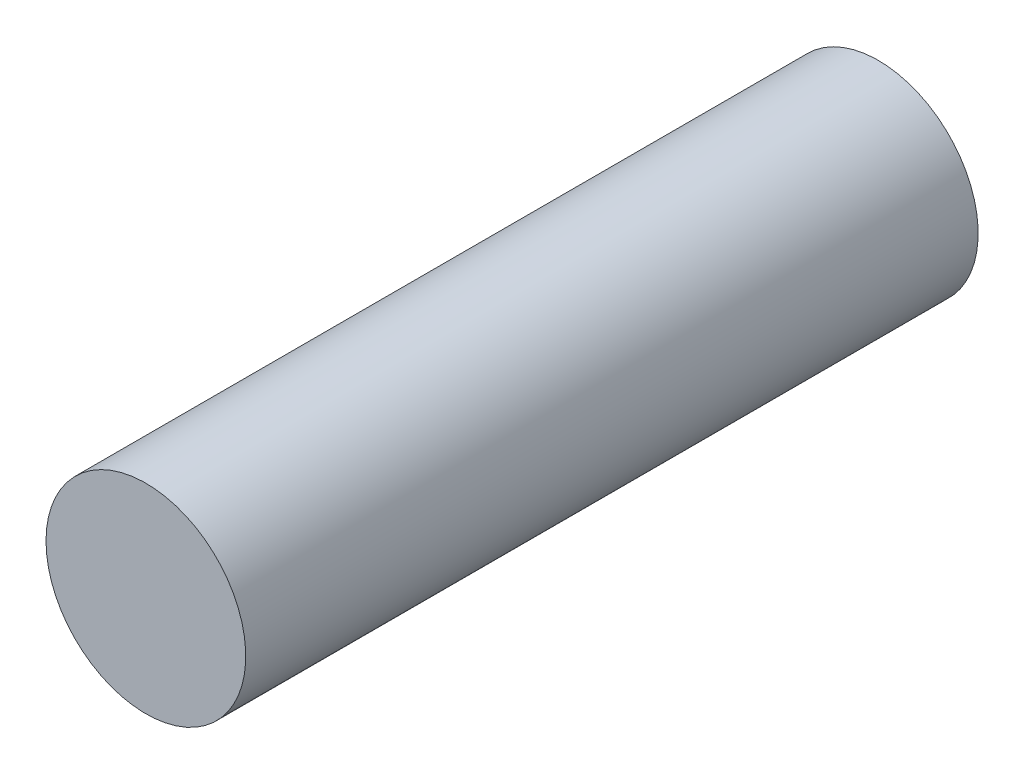
ISO-10303-21;
HEADER;
FILE_DESCRIPTION(('STEP AP214'),'2;1');
FILE_NAME('part.step','',(''),(''),'','','');
FILE_SCHEMA(('AUTOMOTIVE_DESIGN { 1 0 10303 214 1 1 1 1 }'));
ENDSEC;
DATA;
#1=APPLICATION_CONTEXT('core data for automotive mechanical design processes');
#2=APPLICATION_PROTOCOL_DEFINITION('international standard','automotive_design',2000,#1);
#3=PRODUCT_CONTEXT('',#1,'mechanical');
#4=PRODUCT('Part','Part','',(#3));
#5=PRODUCT_RELATED_PRODUCT_CATEGORY('part','',(#4));
#6=PRODUCT_DEFINITION_FORMATION('','',#4);
#7=PRODUCT_DEFINITION_CONTEXT('part definition',#1,'design');
#8=PRODUCT_DEFINITION('design','',#6,#7);
#9=PRODUCT_DEFINITION_SHAPE('','',#8);
#10=(LENGTH_UNIT() NAMED_UNIT(*) SI_UNIT(.MILLI.,.METRE.));
#11=(NAMED_UNIT(*) PLANE_ANGLE_UNIT() SI_UNIT($,.RADIAN.));
#12=(NAMED_UNIT(*) SI_UNIT($,.STERADIAN.) SOLID_ANGLE_UNIT());
#13=UNCERTAINTY_MEASURE_WITH_UNIT(LENGTH_MEASURE(1.E-05),#10,'distance_accuracy_value','');
#14=(GEOMETRIC_REPRESENTATION_CONTEXT(3) GLOBAL_UNCERTAINTY_ASSIGNED_CONTEXT((#13)) GLOBAL_UNIT_ASSIGNED_CONTEXT((#10,
#11,#12)) REPRESENTATION_CONTEXT('',''));
#15=CARTESIAN_POINT('',(0.,0.,0.));
#16=DIRECTION('',(0.,0.,1.));
#17=DIRECTION('',(1.,0.,0.));
#18=AXIS2_PLACEMENT_3D('',#15,#16,#17);
#19=CARTESIAN_POINT('',(-1.5,0.,0.));
#20=DIRECTION('',(0.,0.,-1.));
#21=DIRECTION('',(-1.,0.,0.));
#22=AXIS2_PLACEMENT_3D('',#19,#20,#21);
#23=PLANE('',#22);
#24=CARTESIAN_POINT('',(0.,0.,0.));
#25=DIRECTION('',(0.,0.,-1.));
#26=DIRECTION('',(-1.,0.,0.));
#27=AXIS2_PLACEMENT_3D('',#24,#25,#26);
#28=CIRCLE('',#27,1.5);
#29=CARTESIAN_POINT('',(-1.5,0.,0.));
#30=VERTEX_POINT('',#29);
#31=EDGE_CURVE('E48',#30,#30,#28,.T.);
#32=ORIENTED_EDGE('',*,*,#31,.T.);
#33=EDGE_LOOP('',(#32));
#34=FACE_BOUND('',#33,.T.);
#35=ADVANCED_FACE('F41',(#34),#23,.T.);
#36=CARTESIAN_POINT('',(0.,0.,11.));
#37=DIRECTION('',(0.,0.,1.));
#38=DIRECTION('',(1.,0.,0.));
#39=AXIS2_PLACEMENT_3D('',#36,#37,#38);
#40=PLANE('',#39);
#41=CARTESIAN_POINT('',(0.,0.,11.));
#42=DIRECTION('',(0.,0.,-1.));
#43=DIRECTION('',(-1.,0.,0.));
#44=AXIS2_PLACEMENT_3D('',#41,#42,#43);
#45=CIRCLE('',#44,1.5);
#46=CARTESIAN_POINT('',(-1.5,0.,11.));
#47=VERTEX_POINT('',#46);
#48=EDGE_CURVE('E10',#47,#47,#45,.T.);
#49=ORIENTED_EDGE('',*,*,#48,.F.);
#50=EDGE_LOOP('',(#49));
#51=FACE_BOUND('',#50,.T.);
#52=ADVANCED_FACE('F58',(#51),#40,.T.);
#53=CARTESIAN_POINT('',(0.,0.,0.));
#54=DIRECTION('',(0.,0.,-1.));
#55=DIRECTION('',(-1.,0.,0.));
#56=AXIS2_PLACEMENT_3D('',#53,#54,#55);
#57=CYLINDRICAL_SURFACE('',#56,1.5);
#58=ORIENTED_EDGE('',*,*,#48,.T.);
#59=EDGE_LOOP('',(#58));
#60=FACE_BOUND('',#59,.T.);
#61=ORIENTED_EDGE('',*,*,#31,.F.);
#62=EDGE_LOOP('',(#61));
#63=FACE_BOUND('',#62,.T.);
#64=ADVANCED_FACE('F56',(#60,#63),#57,.T.);
#65=CLOSED_SHELL('',(#35,#52,#64));
#66=MANIFOLD_SOLID_BREP('B2',#65);
#67=ADVANCED_BREP_SHAPE_REPRESENTATION('',(#18,#66),#14);
#68=SHAPE_DEFINITION_REPRESENTATION(#9,#67);
ENDSEC;
END-ISO-10303-21;
